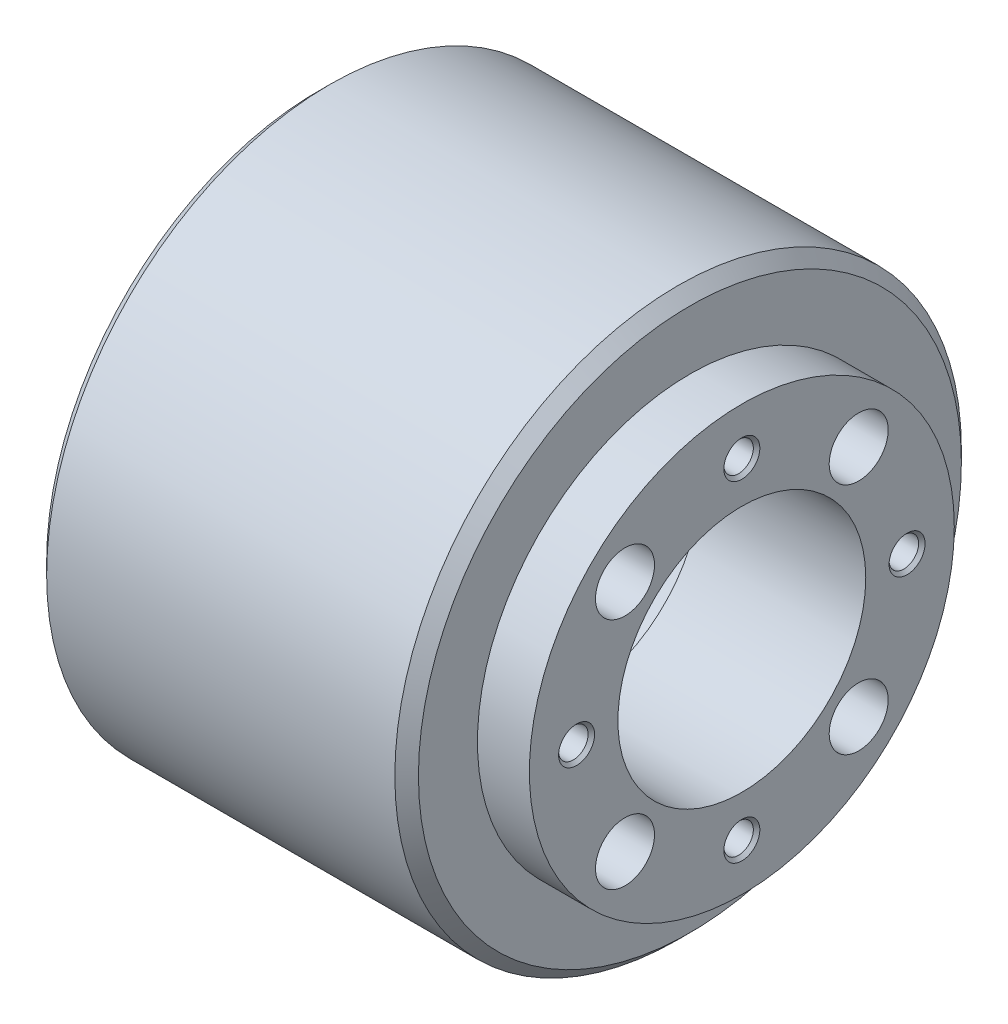
ISO-10303-21;
HEADER;
FILE_DESCRIPTION(('STEP AP214'),'2;1');
FILE_NAME('part.step','',(''),(''),'','','');
FILE_SCHEMA(('AUTOMOTIVE_DESIGN { 1 0 10303 214 1 1 1 1 }'));
ENDSEC;
DATA;
#1=APPLICATION_CONTEXT('core data for automotive mechanical design processes');
#2=APPLICATION_PROTOCOL_DEFINITION('international standard','automotive_design',2000,#1);
#3=PRODUCT_CONTEXT('',#1,'mechanical');
#4=PRODUCT('Part','Part','',(#3));
#5=PRODUCT_RELATED_PRODUCT_CATEGORY('part','',(#4));
#6=PRODUCT_DEFINITION_FORMATION('','',#4);
#7=PRODUCT_DEFINITION_CONTEXT('part definition',#1,'design');
#8=PRODUCT_DEFINITION('design','',#6,#7);
#9=PRODUCT_DEFINITION_SHAPE('','',#8);
#10=(LENGTH_UNIT() NAMED_UNIT(*) SI_UNIT(.MILLI.,.METRE.));
#11=(NAMED_UNIT(*) PLANE_ANGLE_UNIT() SI_UNIT($,.RADIAN.));
#12=(NAMED_UNIT(*) SI_UNIT($,.STERADIAN.) SOLID_ANGLE_UNIT());
#13=UNCERTAINTY_MEASURE_WITH_UNIT(LENGTH_MEASURE(1.E-05),#10,'distance_accuracy_value','');
#14=(GEOMETRIC_REPRESENTATION_CONTEXT(3) GLOBAL_UNCERTAINTY_ASSIGNED_CONTEXT((#13)) GLOBAL_UNIT_ASSIGNED_CONTEXT((#10,
#11,#12)) REPRESENTATION_CONTEXT('',''));
#15=CARTESIAN_POINT('',(0.,0.,0.));
#16=DIRECTION('',(0.,0.,1.));
#17=DIRECTION('',(1.,0.,0.));
#18=AXIS2_PLACEMENT_3D('',#15,#16,#17);
#19=CARTESIAN_POINT('',(0.,0.,19.5));
#20=DIRECTION('',(1.,0.,0.));
#21=DIRECTION('',(0.,0.,1.));
#22=AXIS2_PLACEMENT_3D('',#19,#20,#21);
#23=PLANE('',#22);
#24=CARTESIAN_POINT('',(0.,0.,0.));
#25=DIRECTION('',(-1.,0.,0.));
#26=DIRECTION('',(0.,0.,1.));
#27=AXIS2_PLACEMENT_3D('',#24,#25,#26);
#28=CIRCLE('',#27,20.5);
#29=CARTESIAN_POINT('',(0.,0.,20.5));
#30=VERTEX_POINT('',#29);
#31=EDGE_CURVE('E135',#30,#30,#28,.T.);
#32=ORIENTED_EDGE('',*,*,#31,.F.);
#33=EDGE_LOOP('',(#32));
#34=FACE_BOUND('',#33,.T.);
#35=CARTESIAN_POINT('',(0.,0.,0.));
#36=DIRECTION('',(-1.,0.,0.));
#37=DIRECTION('',(0.,0.,1.));
#38=AXIS2_PLACEMENT_3D('',#35,#36,#37);
#39=CIRCLE('',#38,23.);
#40=CARTESIAN_POINT('',(0.,0.,23.));
#41=VERTEX_POINT('',#40);
#42=EDGE_CURVE('E132',#41,#41,#39,.F.);
#43=ORIENTED_EDGE('',*,*,#42,.F.);
#44=EDGE_LOOP('',(#43));
#45=FACE_BOUND('',#44,.T.);
#46=ADVANCED_FACE('F37',(#34,#45),#23,.F.);
#47=CARTESIAN_POINT('',(0.,0.,0.));
#48=DIRECTION('',(-1.,0.,0.));
#49=DIRECTION('',(0.,0.,-1.));
#50=AXIS2_PLACEMENT_3D('',#47,#48,#49);
#51=CYLINDRICAL_SURFACE('',#50,24.);
#52=CARTESIAN_POINT('',(30.5,0.,0.));
#53=DIRECTION('',(1.,0.,0.));
#54=DIRECTION('',(0.,0.,-1.));
#55=AXIS2_PLACEMENT_3D('',#52,#53,#54);
#56=CIRCLE('',#55,24.);
#57=CARTESIAN_POINT('',(30.5,0.,-24.));
#58=VERTEX_POINT('',#57);
#59=EDGE_CURVE('E45',#58,#58,#56,.T.);
#60=ORIENTED_EDGE('',*,*,#59,.F.);
#61=EDGE_LOOP('',(#60));
#62=FACE_BOUND('',#61,.T.);
#63=CARTESIAN_POINT('',(0.99999999999999,0.,0.));
#64=DIRECTION('',(-1.,0.,0.));
#65=DIRECTION('',(0.,0.,1.));
#66=AXIS2_PLACEMENT_3D('',#63,#64,#65);
#67=CIRCLE('',#66,24.);
#68=CARTESIAN_POINT('',(0.99999999999999,0.,24.));
#69=VERTEX_POINT('',#68);
#70=EDGE_CURVE('E138',#69,#69,#67,.T.);
#71=ORIENTED_EDGE('',*,*,#70,.F.);
#72=EDGE_LOOP('',(#71));
#73=FACE_BOUND('',#72,.T.);
#74=ADVANCED_FACE('F145',(#62,#73),#51,.T.);
#75=CARTESIAN_POINT('',(31.5,0.,24.));
#76=DIRECTION('',(-1.,0.,0.));
#77=DIRECTION('',(0.,0.,-1.));
#78=AXIS2_PLACEMENT_3D('',#75,#76,#77);
#79=PLANE('',#78);
#80=CARTESIAN_POINT('',(31.5,0.,0.));
#81=DIRECTION('',(1.,0.,0.));
#82=DIRECTION('',(0.,0.,-1.));
#83=AXIS2_PLACEMENT_3D('',#80,#81,#82);
#84=CIRCLE('',#83,23.);
#85=CARTESIAN_POINT('',(31.5,0.,-23.));
#86=VERTEX_POINT('',#85);
#87=EDGE_CURVE('E11',#86,#86,#84,.F.);
#88=ORIENTED_EDGE('',*,*,#87,.F.);
#89=EDGE_LOOP('',(#88));
#90=FACE_BOUND('',#89,.T.);
#91=CARTESIAN_POINT('',(31.5,0.,0.));
#92=DIRECTION('',(1.,0.,0.));
#93=DIRECTION('',(0.,0.,-1.));
#94=AXIS2_PLACEMENT_3D('',#91,#92,#93);
#95=CIRCLE('',#94,18.);
#96=CARTESIAN_POINT('',(31.5,0.,-18.));
#97=VERTEX_POINT('',#96);
#98=EDGE_CURVE('E114',#97,#97,#95,.T.);
#99=ORIENTED_EDGE('',*,*,#98,.F.);
#100=EDGE_LOOP('',(#99));
#101=FACE_BOUND('',#100,.T.);
#102=ADVANCED_FACE('F148',(#90,#101),#79,.F.);
#103=CARTESIAN_POINT('',(0.,0.,0.));
#104=DIRECTION('',(-1.,0.,0.));
#105=DIRECTION('',(0.,0.,-1.));
#106=AXIS2_PLACEMENT_3D('',#103,#104,#105);
#107=CYLINDRICAL_SURFACE('',#106,18.);
#108=ORIENTED_EDGE('',*,*,#98,.T.);
#109=EDGE_LOOP('',(#108));
#110=FACE_BOUND('',#109,.T.);
#111=CARTESIAN_POINT('',(35.9,0.,0.));
#112=DIRECTION('',(1.,0.,0.));
#113=DIRECTION('',(0.,0.,-1.));
#114=AXIS2_PLACEMENT_3D('',#111,#112,#113);
#115=CIRCLE('',#114,18.);
#116=CARTESIAN_POINT('',(35.9,0.,-18.));
#117=VERTEX_POINT('',#116);
#118=EDGE_CURVE('E111',#117,#117,#115,.T.);
#119=ORIENTED_EDGE('',*,*,#118,.F.);
#120=EDGE_LOOP('',(#119));
#121=FACE_BOUND('',#120,.T.);
#122=ADVANCED_FACE('F185',(#110,#121),#107,.T.);
#123=CARTESIAN_POINT('',(35.9,0.,10.5));
#124=DIRECTION('',(-1.,0.,0.));
#125=DIRECTION('',(0.,0.,-1.));
#126=AXIS2_PLACEMENT_3D('',#123,#124,#125);
#127=PLANE('',#126);
#128=CARTESIAN_POINT('',(35.9,-9.89949493661167,9.89949493661166));
#129=DIRECTION('',(-1.,0.,0.));
#130=DIRECTION('',(0.,0.,-1.));
#131=AXIS2_PLACEMENT_3D('',#128,#129,#130);
#132=CIRCLE('',#131,2.5);
#133=CARTESIAN_POINT('',(35.9,-9.89949493661167,7.39949493661166));
#134=VERTEX_POINT('',#133);
#135=EDGE_CURVE('E302',#134,#134,#132,.T.);
#136=ORIENTED_EDGE('',*,*,#135,.T.);
#137=EDGE_LOOP('',(#136));
#138=FACE_BOUND('',#137,.T.);
#139=CARTESIAN_POINT('',(35.9,-9.89949493661167,-9.89949493661166));
#140=DIRECTION('',(-1.,0.,0.));
#141=DIRECTION('',(0.,0.,1.));
#142=AXIS2_PLACEMENT_3D('',#139,#140,#141);
#143=CIRCLE('',#142,2.5);
#144=CARTESIAN_POINT('',(35.9,-9.89949493661167,-7.39949493661166));
#145=VERTEX_POINT('',#144);
#146=EDGE_CURVE('E301',#145,#145,#143,.T.);
#147=ORIENTED_EDGE('',*,*,#146,.T.);
#148=EDGE_LOOP('',(#147));
#149=FACE_BOUND('',#148,.T.);
#150=CARTESIAN_POINT('',(35.9,9.89949493661167,9.89949493661167));
#151=DIRECTION('',(-1.,0.,0.));
#152=DIRECTION('',(0.,0.,-1.));
#153=AXIS2_PLACEMENT_3D('',#150,#151,#152);
#154=CIRCLE('',#153,2.5);
#155=CARTESIAN_POINT('',(35.9,9.89949493661167,7.39949493661166));
#156=VERTEX_POINT('',#155);
#157=EDGE_CURVE('E311',#156,#156,#154,.T.);
#158=ORIENTED_EDGE('',*,*,#157,.T.);
#159=EDGE_LOOP('',(#158));
#160=FACE_BOUND('',#159,.T.);
#161=CARTESIAN_POINT('',(35.9,9.89949493661167,-9.89949493661167));
#162=DIRECTION('',(-1.,0.,0.));
#163=DIRECTION('',(0.,0.,1.));
#164=AXIS2_PLACEMENT_3D('',#161,#162,#163);
#165=CIRCLE('',#164,2.5);
#166=CARTESIAN_POINT('',(35.9,9.89949493661167,-7.39949493661166));
#167=VERTEX_POINT('',#166);
#168=EDGE_CURVE('E316',#167,#167,#165,.T.);
#169=ORIENTED_EDGE('',*,*,#168,.T.);
#170=EDGE_LOOP('',(#169));
#171=FACE_BOUND('',#170,.T.);
#172=CARTESIAN_POINT('',(35.9,14.,0.));
#173=DIRECTION('',(-1.,0.,0.));
#174=DIRECTION('',(0.,0.,1.));
#175=AXIS2_PLACEMENT_3D('',#172,#173,#174);
#176=CIRCLE('',#175,1.525);
#177=CARTESIAN_POINT('',(35.9,14.,1.525));
#178=VERTEX_POINT('',#177);
#179=EDGE_CURVE('E75',#178,#178,#176,.T.);
#180=ORIENTED_EDGE('',*,*,#179,.T.);
#181=EDGE_LOOP('',(#180));
#182=FACE_BOUND('',#181,.T.);
#183=CARTESIAN_POINT('',(35.9,0.,14.));
#184=DIRECTION('',(-1.,0.,0.));
#185=DIRECTION('',(0.,0.,1.));
#186=AXIS2_PLACEMENT_3D('',#183,#184,#185);
#187=CIRCLE('',#186,1.525);
#188=CARTESIAN_POINT('',(35.9,0.,15.525));
#189=VERTEX_POINT('',#188);
#190=EDGE_CURVE('E68',#189,#189,#187,.T.);
#191=ORIENTED_EDGE('',*,*,#190,.T.);
#192=EDGE_LOOP('',(#191));
#193=FACE_BOUND('',#192,.T.);
#194=CARTESIAN_POINT('',(35.9,-14.,0.));
#195=DIRECTION('',(-1.,0.,0.));
#196=DIRECTION('',(0.,0.,1.));
#197=AXIS2_PLACEMENT_3D('',#194,#195,#196);
#198=CIRCLE('',#197,1.525);
#199=CARTESIAN_POINT('',(35.9,-14.,1.525));
#200=VERTEX_POINT('',#199);
#201=EDGE_CURVE('E84',#200,#200,#198,.T.);
#202=ORIENTED_EDGE('',*,*,#201,.T.);
#203=EDGE_LOOP('',(#202));
#204=FACE_BOUND('',#203,.T.);
#205=CARTESIAN_POINT('',(35.9,0.,-14.));
#206=DIRECTION('',(-1.,0.,0.));
#207=DIRECTION('',(0.,0.,1.));
#208=AXIS2_PLACEMENT_3D('',#205,#206,#207);
#209=CIRCLE('',#208,1.525);
#210=CARTESIAN_POINT('',(35.9,0.,-12.475));
#211=VERTEX_POINT('',#210);
#212=EDGE_CURVE('E93',#211,#211,#209,.T.);
#213=ORIENTED_EDGE('',*,*,#212,.T.);
#214=EDGE_LOOP('',(#213));
#215=FACE_BOUND('',#214,.T.);
#216=ORIENTED_EDGE('',*,*,#118,.T.);
#217=EDGE_LOOP('',(#216));
#218=FACE_BOUND('',#217,.T.);
#219=CARTESIAN_POINT('',(35.9,0.,0.));
#220=DIRECTION('',(1.,0.,0.));
#221=DIRECTION('',(0.,0.,-1.));
#222=AXIS2_PLACEMENT_3D('',#219,#220,#221);
#223=CIRCLE('',#222,10.5);
#224=CARTESIAN_POINT('',(35.9,0.,-10.5));
#225=VERTEX_POINT('',#224);
#226=EDGE_CURVE('E108',#225,#225,#223,.T.);
#227=ORIENTED_EDGE('',*,*,#226,.F.);
#228=EDGE_LOOP('',(#227));
#229=FACE_BOUND('',#228,.T.);
#230=ADVANCED_FACE('F190',(#138,#149,#160,#171,#182,#193,#204,#215,#218,#229),#127,.F.);
#231=CARTESIAN_POINT('',(0.,0.,0.));
#232=DIRECTION('',(-1.,0.,0.));
#233=DIRECTION('',(0.,0.,-1.));
#234=AXIS2_PLACEMENT_3D('',#231,#232,#233);
#235=CYLINDRICAL_SURFACE('',#234,10.5);
#236=ORIENTED_EDGE('',*,*,#226,.T.);
#237=EDGE_LOOP('',(#236));
#238=FACE_BOUND('',#237,.T.);
#239=CARTESIAN_POINT('',(21.9,0.,0.));
#240=DIRECTION('',(1.,0.,0.));
#241=DIRECTION('',(0.,0.,-1.));
#242=AXIS2_PLACEMENT_3D('',#239,#240,#241);
#243=CIRCLE('',#242,10.5);
#244=CARTESIAN_POINT('',(21.9,0.,-10.5));
#245=VERTEX_POINT('',#244);
#246=EDGE_CURVE('E105',#245,#245,#243,.T.);
#247=ORIENTED_EDGE('',*,*,#246,.F.);
#248=EDGE_LOOP('',(#247));
#249=FACE_BOUND('',#248,.T.);
#250=ADVANCED_FACE('F196',(#238,#249),#235,.F.);
#251=CARTESIAN_POINT('',(21.9,0.,15.));
#252=DIRECTION('',(1.,0.,0.));
#253=DIRECTION('',(0.,0.,1.));
#254=AXIS2_PLACEMENT_3D('',#251,#252,#253);
#255=PLANE('',#254);
#256=ORIENTED_EDGE('',*,*,#246,.T.);
#257=EDGE_LOOP('',(#256));
#258=FACE_BOUND('',#257,.T.);
#259=CARTESIAN_POINT('',(21.9,0.,0.));
#260=DIRECTION('',(1.,0.,0.));
#261=DIRECTION('',(0.,0.,-1.));
#262=AXIS2_PLACEMENT_3D('',#259,#260,#261);
#263=CIRCLE('',#262,15.);
#264=CARTESIAN_POINT('',(21.9,0.,-15.));
#265=VERTEX_POINT('',#264);
#266=EDGE_CURVE('E102',#265,#265,#263,.T.);
#267=ORIENTED_EDGE('',*,*,#266,.F.);
#268=EDGE_LOOP('',(#267));
#269=FACE_BOUND('',#268,.T.);
#270=ADVANCED_FACE('F203',(#258,#269),#255,.F.);
#271=CARTESIAN_POINT('',(0.,0.,0.));
#272=DIRECTION('',(-1.,0.,0.));
#273=DIRECTION('',(0.,0.,-1.));
#274=AXIS2_PLACEMENT_3D('',#271,#272,#273);
#275=CYLINDRICAL_SURFACE('',#274,15.);
#276=CARTESIAN_POINT('',(6.39999999999999,0.,0.));
#277=DIRECTION('',(-1.,0.,0.));
#278=DIRECTION('',(0.,0.,1.));
#279=AXIS2_PLACEMENT_3D('',#276,#277,#278);
#280=CIRCLE('',#279,15.);
#281=CARTESIAN_POINT('',(6.39999999999999,0.,15.));
#282=VERTEX_POINT('',#281);
#283=EDGE_CURVE('E129',#282,#282,#280,.F.);
#284=ORIENTED_EDGE('',*,*,#283,.F.);
#285=EDGE_LOOP('',(#284));
#286=FACE_BOUND('',#285,.T.);
#287=ORIENTED_EDGE('',*,*,#266,.T.);
#288=EDGE_LOOP('',(#287));
#289=FACE_BOUND('',#288,.T.);
#290=ADVANCED_FACE('F209',(#286,#289),#275,.F.);
#291=CARTESIAN_POINT('',(5.4,0.,15.));
#292=DIRECTION('',(1.,0.,0.));
#293=DIRECTION('',(0.,0.,1.));
#294=AXIS2_PLACEMENT_3D('',#291,#292,#293);
#295=PLANE('',#294);
#296=CARTESIAN_POINT('',(5.4,0.,0.));
#297=DIRECTION('',(-1.,0.,0.));
#298=DIRECTION('',(0.,0.,1.));
#299=AXIS2_PLACEMENT_3D('',#296,#297,#298);
#300=CIRCLE('',#299,18.5);
#301=CARTESIAN_POINT('',(5.4,0.,18.5));
#302=VERTEX_POINT('',#301);
#303=EDGE_CURVE('E120',#302,#302,#300,.F.);
#304=ORIENTED_EDGE('',*,*,#303,.F.);
#305=EDGE_LOOP('',(#304));
#306=FACE_BOUND('',#305,.T.);
#307=CARTESIAN_POINT('',(5.4,0.,0.));
#308=DIRECTION('',(-1.,0.,0.));
#309=DIRECTION('',(0.,0.,1.));
#310=AXIS2_PLACEMENT_3D('',#307,#308,#309);
#311=CIRCLE('',#310,16.);
#312=CARTESIAN_POINT('',(5.4,0.,16.));
#313=VERTEX_POINT('',#312);
#314=EDGE_CURVE('E117',#313,#313,#311,.T.);
#315=ORIENTED_EDGE('',*,*,#314,.F.);
#316=EDGE_LOOP('',(#315));
#317=FACE_BOUND('',#316,.T.);
#318=ADVANCED_FACE('F214',(#306,#317),#295,.F.);
#319=CARTESIAN_POINT('',(0.,0.,0.));
#320=DIRECTION('',(-1.,0.,0.));
#321=DIRECTION('',(0.,0.,-1.));
#322=AXIS2_PLACEMENT_3D('',#319,#320,#321);
#323=CYLINDRICAL_SURFACE('',#322,19.5);
#324=CARTESIAN_POINT('',(4.4,0.,0.));
#325=DIRECTION('',(-1.,0.,0.));
#326=DIRECTION('',(0.,0.,1.));
#327=AXIS2_PLACEMENT_3D('',#324,#325,#326);
#328=CIRCLE('',#327,19.5);
#329=CARTESIAN_POINT('',(4.4,0.,19.5));
#330=VERTEX_POINT('',#329);
#331=EDGE_CURVE('E126',#330,#330,#328,.T.);
#332=ORIENTED_EDGE('',*,*,#331,.F.);
#333=EDGE_LOOP('',(#332));
#334=FACE_BOUND('',#333,.T.);
#335=CARTESIAN_POINT('',(1.00000000000002,0.,0.));
#336=DIRECTION('',(-1.,0.,0.));
#337=DIRECTION('',(0.,0.,1.));
#338=AXIS2_PLACEMENT_3D('',#335,#336,#337);
#339=CIRCLE('',#338,19.5);
#340=CARTESIAN_POINT('',(1.00000000000002,0.,19.5));
#341=VERTEX_POINT('',#340);
#342=EDGE_CURVE('E123',#341,#341,#339,.F.);
#343=ORIENTED_EDGE('',*,*,#342,.F.);
#344=EDGE_LOOP('',(#343));
#345=FACE_BOUND('',#344,.T.);
#346=ADVANCED_FACE('F169',(#334,#345),#323,.F.);
#347=CARTESIAN_POINT('',(5.4,0.,0.));
#348=DIRECTION('',(-1.,0.,0.));
#349=DIRECTION('',(0.,0.,-1.));
#350=AXIS2_PLACEMENT_3D('',#347,#348,#349);
#351=CONICAL_SURFACE('',#350,18.5,0.785398163397454);
#352=ORIENTED_EDGE('',*,*,#331,.T.);
#353=EDGE_LOOP('',(#352));
#354=FACE_BOUND('',#353,.T.);
#355=ORIENTED_EDGE('',*,*,#303,.T.);
#356=EDGE_LOOP('',(#355));
#357=FACE_BOUND('',#356,.T.);
#358=ADVANCED_FACE('F165',(#354,#357),#351,.F.);
#359=CARTESIAN_POINT('',(6.39999999999999,0.,0.));
#360=DIRECTION('',(-1.,0.,0.));
#361=DIRECTION('',(0.,0.,-1.));
#362=AXIS2_PLACEMENT_3D('',#359,#360,#361);
#363=CONICAL_SURFACE('',#362,15.,0.785398163397453);
#364=ORIENTED_EDGE('',*,*,#314,.T.);
#365=EDGE_LOOP('',(#364));
#366=FACE_BOUND('',#365,.T.);
#367=ORIENTED_EDGE('',*,*,#283,.T.);
#368=EDGE_LOOP('',(#367));
#369=FACE_BOUND('',#368,.T.);
#370=ADVANCED_FACE('F168',(#366,#369),#363,.F.);
#371=CARTESIAN_POINT('',(1.00000000000002,0.,0.));
#372=DIRECTION('',(-1.,0.,0.));
#373=DIRECTION('',(0.,0.,-1.));
#374=AXIS2_PLACEMENT_3D('',#371,#372,#373);
#375=CONICAL_SURFACE('',#374,19.5,0.785398163397447);
#376=ORIENTED_EDGE('',*,*,#31,.T.);
#377=EDGE_LOOP('',(#376));
#378=FACE_BOUND('',#377,.T.);
#379=ORIENTED_EDGE('',*,*,#342,.T.);
#380=EDGE_LOOP('',(#379));
#381=FACE_BOUND('',#380,.T.);
#382=ADVANCED_FACE('F173',(#378,#381),#375,.F.);
#383=CARTESIAN_POINT('',(30.5,0.,0.));
#384=DIRECTION('',(-1.,0.,0.));
#385=DIRECTION('',(0.,0.,-1.));
#386=AXIS2_PLACEMENT_3D('',#383,#384,#385);
#387=CONICAL_SURFACE('',#386,24.,0.785398163397453);
#388=ORIENTED_EDGE('',*,*,#87,.T.);
#389=EDGE_LOOP('',(#388));
#390=FACE_BOUND('',#389,.T.);
#391=ORIENTED_EDGE('',*,*,#59,.T.);
#392=EDGE_LOOP('',(#391));
#393=FACE_BOUND('',#392,.T.);
#394=ADVANCED_FACE('F143',(#390,#393),#387,.T.);
#395=CARTESIAN_POINT('',(0.,0.,0.));
#396=DIRECTION('',(1.,0.,0.));
#397=DIRECTION('',(0.,0.,1.));
#398=AXIS2_PLACEMENT_3D('',#395,#396,#397);
#399=CONICAL_SURFACE('',#398,23.,0.785398163397445);
#400=ORIENTED_EDGE('',*,*,#70,.T.);
#401=EDGE_LOOP('',(#400));
#402=FACE_BOUND('',#401,.T.);
#403=ORIENTED_EDGE('',*,*,#42,.T.);
#404=EDGE_LOOP('',(#403));
#405=FACE_BOUND('',#404,.T.);
#406=ADVANCED_FACE('F39',(#402,#405),#399,.T.);
#407=CARTESIAN_POINT('',(27.4,0.,-14.));
#408=DIRECTION('',(1.,0.,0.));
#409=DIRECTION('',(0.,0.,1.));
#410=AXIS2_PLACEMENT_3D('',#407,#408,#409);
#411=CONICAL_SURFACE('',#410,1.25,1.02974425867665);
#412=CARTESIAN_POINT('',(26.6489242262156,0.,-14.));
#413=VERTEX_POINT('',#412);
#414=VERTEX_LOOP('',#413);
#415=FACE_BOUND('',#414,.T.);
#416=CARTESIAN_POINT('',(27.4,0.,-14.));
#417=DIRECTION('',(-1.,0.,0.));
#418=DIRECTION('',(0.,0.,1.));
#419=AXIS2_PLACEMENT_3D('',#416,#417,#418);
#420=CIRCLE('',#419,1.25);
#421=CARTESIAN_POINT('',(27.4,0.,-12.75));
#422=VERTEX_POINT('',#421);
#423=EDGE_CURVE('E99',#422,#422,#420,.T.);
#424=ORIENTED_EDGE('',*,*,#423,.F.);
#425=EDGE_LOOP('',(#424));
#426=FACE_BOUND('',#425,.T.);
#427=ADVANCED_FACE('F154',(#415,#426),#411,.F.);
#428=CARTESIAN_POINT('',(35.9,0.,-14.));
#429=DIRECTION('',(1.,0.,0.));
#430=DIRECTION('',(0.,0.,1.));
#431=AXIS2_PLACEMENT_3D('',#428,#429,#430);
#432=CYLINDRICAL_SURFACE('',#431,1.25);
#433=ORIENTED_EDGE('',*,*,#423,.T.);
#434=EDGE_LOOP('',(#433));
#435=FACE_BOUND('',#434,.T.);
#436=CARTESIAN_POINT('',(35.625,0.,-14.));
#437=DIRECTION('',(-1.,0.,0.));
#438=DIRECTION('',(0.,0.,1.));
#439=AXIS2_PLACEMENT_3D('',#436,#437,#438);
#440=CIRCLE('',#439,1.25);
#441=CARTESIAN_POINT('',(35.625,0.,-12.75));
#442=VERTEX_POINT('',#441);
#443=EDGE_CURVE('E96',#442,#442,#440,.T.);
#444=ORIENTED_EDGE('',*,*,#443,.F.);
#445=EDGE_LOOP('',(#444));
#446=FACE_BOUND('',#445,.T.);
#447=ADVANCED_FACE('F229',(#435,#446),#432,.F.);
#448=CARTESIAN_POINT('',(35.9,0.,-14.));
#449=DIRECTION('',(1.,0.,0.));
#450=DIRECTION('',(0.,0.,1.));
#451=AXIS2_PLACEMENT_3D('',#448,#449,#450);
#452=CONICAL_SURFACE('',#451,1.525,0.785398163397442);
#453=ORIENTED_EDGE('',*,*,#443,.T.);
#454=EDGE_LOOP('',(#453));
#455=FACE_BOUND('',#454,.T.);
#456=ORIENTED_EDGE('',*,*,#212,.F.);
#457=EDGE_LOOP('',(#456));
#458=FACE_BOUND('',#457,.T.);
#459=ADVANCED_FACE('F232',(#455,#458),#452,.F.);
#460=CARTESIAN_POINT('',(27.4,-14.,0.));
#461=DIRECTION('',(1.,0.,0.));
#462=DIRECTION('',(0.,0.,1.));
#463=AXIS2_PLACEMENT_3D('',#460,#461,#462);
#464=CONICAL_SURFACE('',#463,1.25,1.02974425867665);
#465=CARTESIAN_POINT('',(26.6489242262156,-14.,0.));
#466=VERTEX_POINT('',#465);
#467=VERTEX_LOOP('',#466);
#468=FACE_BOUND('',#467,.T.);
#469=CARTESIAN_POINT('',(27.4,-14.,0.));
#470=DIRECTION('',(-1.,0.,0.));
#471=DIRECTION('',(0.,0.,1.));
#472=AXIS2_PLACEMENT_3D('',#469,#470,#471);
#473=CIRCLE('',#472,1.25);
#474=CARTESIAN_POINT('',(27.4,-14.,1.25));
#475=VERTEX_POINT('',#474);
#476=EDGE_CURVE('E90',#475,#475,#473,.T.);
#477=ORIENTED_EDGE('',*,*,#476,.F.);
#478=EDGE_LOOP('',(#477));
#479=FACE_BOUND('',#478,.T.);
#480=ADVANCED_FACE('F236',(#468,#479),#464,.F.);
#481=CARTESIAN_POINT('',(35.9,-14.,0.));
#482=DIRECTION('',(1.,0.,0.));
#483=DIRECTION('',(0.,0.,1.));
#484=AXIS2_PLACEMENT_3D('',#481,#482,#483);
#485=CYLINDRICAL_SURFACE('',#484,1.25);
#486=ORIENTED_EDGE('',*,*,#476,.T.);
#487=EDGE_LOOP('',(#486));
#488=FACE_BOUND('',#487,.T.);
#489=CARTESIAN_POINT('',(35.625,-14.,0.));
#490=DIRECTION('',(-1.,0.,0.));
#491=DIRECTION('',(0.,0.,1.));
#492=AXIS2_PLACEMENT_3D('',#489,#490,#491);
#493=CIRCLE('',#492,1.25);
#494=CARTESIAN_POINT('',(35.625,-14.,1.25));
#495=VERTEX_POINT('',#494);
#496=EDGE_CURVE('E87',#495,#495,#493,.T.);
#497=ORIENTED_EDGE('',*,*,#496,.F.);
#498=EDGE_LOOP('',(#497));
#499=FACE_BOUND('',#498,.T.);
#500=ADVANCED_FACE('F240',(#488,#499),#485,.F.);
#501=CARTESIAN_POINT('',(35.9,-14.,0.));
#502=DIRECTION('',(1.,0.,0.));
#503=DIRECTION('',(0.,0.,1.));
#504=AXIS2_PLACEMENT_3D('',#501,#502,#503);
#505=CONICAL_SURFACE('',#504,1.525,0.785398163397442);
#506=ORIENTED_EDGE('',*,*,#496,.T.);
#507=EDGE_LOOP('',(#506));
#508=FACE_BOUND('',#507,.T.);
#509=ORIENTED_EDGE('',*,*,#201,.F.);
#510=EDGE_LOOP('',(#509));
#511=FACE_BOUND('',#510,.T.);
#512=ADVANCED_FACE('F243',(#508,#511),#505,.F.);
#513=CARTESIAN_POINT('',(27.4,0.,14.));
#514=DIRECTION('',(1.,0.,0.));
#515=DIRECTION('',(0.,0.,1.));
#516=AXIS2_PLACEMENT_3D('',#513,#514,#515);
#517=CONICAL_SURFACE('',#516,1.25,1.02974425867665);
#518=CARTESIAN_POINT('',(26.6489242262156,0.,14.));
#519=VERTEX_POINT('',#518);
#520=VERTEX_LOOP('',#519);
#521=FACE_BOUND('',#520,.T.);
#522=CARTESIAN_POINT('',(27.4,0.,14.));
#523=DIRECTION('',(-1.,0.,0.));
#524=DIRECTION('',(0.,0.,1.));
#525=AXIS2_PLACEMENT_3D('',#522,#523,#524);
#526=CIRCLE('',#525,1.25);
#527=CARTESIAN_POINT('',(27.4,0.,15.25));
#528=VERTEX_POINT('',#527);
#529=EDGE_CURVE('E81',#528,#528,#526,.T.);
#530=ORIENTED_EDGE('',*,*,#529,.F.);
#531=EDGE_LOOP('',(#530));
#532=FACE_BOUND('',#531,.T.);
#533=ADVANCED_FACE('F247',(#521,#532),#517,.F.);
#534=CARTESIAN_POINT('',(35.9,0.,14.));
#535=DIRECTION('',(1.,0.,0.));
#536=DIRECTION('',(0.,0.,1.));
#537=AXIS2_PLACEMENT_3D('',#534,#535,#536);
#538=CYLINDRICAL_SURFACE('',#537,1.25);
#539=ORIENTED_EDGE('',*,*,#529,.T.);
#540=EDGE_LOOP('',(#539));
#541=FACE_BOUND('',#540,.T.);
#542=CARTESIAN_POINT('',(35.625,0.,14.));
#543=DIRECTION('',(-1.,0.,0.));
#544=DIRECTION('',(0.,0.,1.));
#545=AXIS2_PLACEMENT_3D('',#542,#543,#544);
#546=CIRCLE('',#545,1.25);
#547=CARTESIAN_POINT('',(35.625,0.,15.25));
#548=VERTEX_POINT('',#547);
#549=EDGE_CURVE('E72',#548,#548,#546,.T.);
#550=ORIENTED_EDGE('',*,*,#549,.F.);
#551=EDGE_LOOP('',(#550));
#552=FACE_BOUND('',#551,.T.);
#553=ADVANCED_FACE('F251',(#541,#552),#538,.F.);
#554=CARTESIAN_POINT('',(35.9,0.,14.));
#555=DIRECTION('',(1.,0.,0.));
#556=DIRECTION('',(0.,0.,1.));
#557=AXIS2_PLACEMENT_3D('',#554,#555,#556);
#558=CONICAL_SURFACE('',#557,1.525,0.785398163397442);
#559=ORIENTED_EDGE('',*,*,#549,.T.);
#560=EDGE_LOOP('',(#559));
#561=FACE_BOUND('',#560,.T.);
#562=ORIENTED_EDGE('',*,*,#190,.F.);
#563=EDGE_LOOP('',(#562));
#564=FACE_BOUND('',#563,.T.);
#565=ADVANCED_FACE('F62',(#561,#564),#558,.F.);
#566=CARTESIAN_POINT('',(27.4,14.,0.));
#567=DIRECTION('',(1.,0.,0.));
#568=DIRECTION('',(0.,0.,1.));
#569=AXIS2_PLACEMENT_3D('',#566,#567,#568);
#570=CONICAL_SURFACE('',#569,1.25,1.02974425867665);
#571=CARTESIAN_POINT('',(26.6489242262156,14.,0.));
#572=VERTEX_POINT('',#571);
#573=VERTEX_LOOP('',#572);
#574=FACE_BOUND('',#573,.T.);
#575=CARTESIAN_POINT('',(27.4,14.,0.));
#576=DIRECTION('',(-1.,0.,0.));
#577=DIRECTION('',(0.,0.,1.));
#578=AXIS2_PLACEMENT_3D('',#575,#576,#577);
#579=CIRCLE('',#578,1.25);
#580=CARTESIAN_POINT('',(27.4,14.,1.25));
#581=VERTEX_POINT('',#580);
#582=EDGE_CURVE('E66',#581,#581,#579,.T.);
#583=ORIENTED_EDGE('',*,*,#582,.F.);
#584=EDGE_LOOP('',(#583));
#585=FACE_BOUND('',#584,.T.);
#586=ADVANCED_FACE('F58',(#574,#585),#570,.F.);
#587=CARTESIAN_POINT('',(35.9,14.,0.));
#588=DIRECTION('',(1.,0.,0.));
#589=DIRECTION('',(0.,0.,1.));
#590=AXIS2_PLACEMENT_3D('',#587,#588,#589);
#591=CYLINDRICAL_SURFACE('',#590,1.25);
#592=ORIENTED_EDGE('',*,*,#582,.T.);
#593=EDGE_LOOP('',(#592));
#594=FACE_BOUND('',#593,.T.);
#595=CARTESIAN_POINT('',(35.625,14.,0.));
#596=DIRECTION('',(-1.,0.,0.));
#597=DIRECTION('',(0.,0.,1.));
#598=AXIS2_PLACEMENT_3D('',#595,#596,#597);
#599=CIRCLE('',#598,1.25);
#600=CARTESIAN_POINT('',(35.625,14.,1.25));
#601=VERTEX_POINT('',#600);
#602=EDGE_CURVE('E69',#601,#601,#599,.T.);
#603=ORIENTED_EDGE('',*,*,#602,.F.);
#604=EDGE_LOOP('',(#603));
#605=FACE_BOUND('',#604,.T.);
#606=ADVANCED_FACE('F61',(#594,#605),#591,.F.);
#607=CARTESIAN_POINT('',(35.9,14.,0.));
#608=DIRECTION('',(1.,0.,0.));
#609=DIRECTION('',(0.,0.,1.));
#610=AXIS2_PLACEMENT_3D('',#607,#608,#609);
#611=CONICAL_SURFACE('',#610,1.525,0.785398163397442);
#612=ORIENTED_EDGE('',*,*,#602,.T.);
#613=EDGE_LOOP('',(#612));
#614=FACE_BOUND('',#613,.T.);
#615=ORIENTED_EDGE('',*,*,#179,.F.);
#616=EDGE_LOOP('',(#615));
#617=FACE_BOUND('',#616,.T.);
#618=ADVANCED_FACE('F261',(#614,#617),#611,.F.);
#619=CARTESIAN_POINT('',(25.9,9.89949493661167,-9.89949493661167));
#620=DIRECTION('',(1.,0.,0.));
#621=DIRECTION('',(0.,0.,1.));
#622=AXIS2_PLACEMENT_3D('',#619,#620,#621);
#623=CYLINDRICAL_SURFACE('',#622,2.5);
#624=CARTESIAN_POINT('',(25.9,9.89949493661167,-9.89949493661167));
#625=DIRECTION('',(-1.,0.,0.));
#626=DIRECTION('',(0.,0.,1.));
#627=AXIS2_PLACEMENT_3D('',#624,#625,#626);
#628=CIRCLE('',#627,2.5);
#629=CARTESIAN_POINT('',(25.9,9.89949493661167,-7.39949493661166));
#630=VERTEX_POINT('',#629);
#631=EDGE_CURVE('E319',#630,#630,#628,.T.);
#632=ORIENTED_EDGE('',*,*,#631,.T.);
#633=EDGE_LOOP('',(#632));
#634=FACE_BOUND('',#633,.T.);
#635=ORIENTED_EDGE('',*,*,#168,.F.);
#636=EDGE_LOOP('',(#635));
#637=FACE_BOUND('',#636,.T.);
#638=ADVANCED_FACE('F264',(#634,#637),#623,.F.);
#639=CARTESIAN_POINT('',(25.9,9.89949493661167,-9.89949493661167));
#640=DIRECTION('',(1.,0.,0.));
#641=DIRECTION('',(0.,0.,1.));
#642=AXIS2_PLACEMENT_3D('',#639,#640,#641);
#643=PLANE('',#642);
#644=ORIENTED_EDGE('',*,*,#631,.F.);
#645=EDGE_LOOP('',(#644));
#646=FACE_BOUND('',#645,.T.);
#647=ADVANCED_FACE('F268',(#646),#643,.T.);
#648=CARTESIAN_POINT('',(25.9,9.89949493661167,9.89949493661167));
#649=DIRECTION('',(1.,0.,0.));
#650=DIRECTION('',(0.,0.,1.));
#651=AXIS2_PLACEMENT_3D('',#648,#649,#650);
#652=CYLINDRICAL_SURFACE('',#651,2.5);
#653=CARTESIAN_POINT('',(25.9,9.89949493661167,9.89949493661167));
#654=DIRECTION('',(-1.,0.,0.));
#655=DIRECTION('',(0.,0.,-1.));
#656=AXIS2_PLACEMENT_3D('',#653,#654,#655);
#657=CIRCLE('',#656,2.5);
#658=CARTESIAN_POINT('',(25.9,9.89949493661167,7.39949493661166));
#659=VERTEX_POINT('',#658);
#660=EDGE_CURVE('E313',#659,#659,#657,.T.);
#661=ORIENTED_EDGE('',*,*,#660,.T.);
#662=EDGE_LOOP('',(#661));
#663=FACE_BOUND('',#662,.T.);
#664=ORIENTED_EDGE('',*,*,#157,.F.);
#665=EDGE_LOOP('',(#664));
#666=FACE_BOUND('',#665,.T.);
#667=ADVANCED_FACE('F272',(#663,#666),#652,.F.);
#668=CARTESIAN_POINT('',(25.9,9.89949493661167,9.89949493661167));
#669=DIRECTION('',(-1.,0.,0.));
#670=DIRECTION('',(0.,0.,-1.));
#671=AXIS2_PLACEMENT_3D('',#668,#669,#670);
#672=PLANE('',#671);
#673=ORIENTED_EDGE('',*,*,#660,.F.);
#674=EDGE_LOOP('',(#673));
#675=FACE_BOUND('',#674,.T.);
#676=ADVANCED_FACE('F276',(#675),#672,.F.);
#677=CARTESIAN_POINT('',(25.9,-9.89949493661167,-9.89949493661166));
#678=DIRECTION('',(1.,0.,0.));
#679=DIRECTION('',(0.,0.,1.));
#680=AXIS2_PLACEMENT_3D('',#677,#678,#679);
#681=CYLINDRICAL_SURFACE('',#680,2.5);
#682=CARTESIAN_POINT('',(25.9,-9.89949493661167,-9.89949493661166));
#683=DIRECTION('',(-1.,0.,0.));
#684=DIRECTION('',(0.,0.,1.));
#685=AXIS2_PLACEMENT_3D('',#682,#683,#684);
#686=CIRCLE('',#685,2.5);
#687=CARTESIAN_POINT('',(25.9,-9.89949493661167,-7.39949493661166));
#688=VERTEX_POINT('',#687);
#689=EDGE_CURVE('E305',#688,#688,#686,.T.);
#690=ORIENTED_EDGE('',*,*,#689,.T.);
#691=EDGE_LOOP('',(#690));
#692=FACE_BOUND('',#691,.T.);
#693=ORIENTED_EDGE('',*,*,#146,.F.);
#694=EDGE_LOOP('',(#693));
#695=FACE_BOUND('',#694,.T.);
#696=ADVANCED_FACE('F280',(#692,#695),#681,.F.);
#697=CARTESIAN_POINT('',(25.9,-9.89949493661167,-9.89949493661166));
#698=DIRECTION('',(1.,0.,0.));
#699=DIRECTION('',(0.,0.,1.));
#700=AXIS2_PLACEMENT_3D('',#697,#698,#699);
#701=PLANE('',#700);
#702=ORIENTED_EDGE('',*,*,#689,.F.);
#703=EDGE_LOOP('',(#702));
#704=FACE_BOUND('',#703,.T.);
#705=ADVANCED_FACE('F284',(#704),#701,.T.);
#706=CARTESIAN_POINT('',(25.9,-9.89949493661167,9.89949493661166));
#707=DIRECTION('',(1.,0.,0.));
#708=DIRECTION('',(0.,0.,1.));
#709=AXIS2_PLACEMENT_3D('',#706,#707,#708);
#710=CYLINDRICAL_SURFACE('',#709,2.5);
#711=CARTESIAN_POINT('',(25.9,-9.89949493661167,9.89949493661166));
#712=DIRECTION('',(-1.,0.,0.));
#713=DIRECTION('',(0.,0.,-1.));
#714=AXIS2_PLACEMENT_3D('',#711,#712,#713);
#715=CIRCLE('',#714,2.5);
#716=CARTESIAN_POINT('',(25.9,-9.89949493661167,7.39949493661166));
#717=VERTEX_POINT('',#716);
#718=EDGE_CURVE('E300',#717,#717,#715,.T.);
#719=ORIENTED_EDGE('',*,*,#718,.T.);
#720=EDGE_LOOP('',(#719));
#721=FACE_BOUND('',#720,.T.);
#722=ORIENTED_EDGE('',*,*,#135,.F.);
#723=EDGE_LOOP('',(#722));
#724=FACE_BOUND('',#723,.T.);
#725=ADVANCED_FACE('F288',(#721,#724),#710,.F.);
#726=CARTESIAN_POINT('',(25.9,-9.89949493661167,9.89949493661166));
#727=DIRECTION('',(-1.,0.,0.));
#728=DIRECTION('',(0.,0.,-1.));
#729=AXIS2_PLACEMENT_3D('',#726,#727,#728);
#730=PLANE('',#729);
#731=ORIENTED_EDGE('',*,*,#718,.F.);
#732=EDGE_LOOP('',(#731));
#733=FACE_BOUND('',#732,.T.);
#734=ADVANCED_FACE('F292',(#733),#730,.F.);
#735=CLOSED_SHELL('',(#46,#74,#102,#122,#230,#250,#270,#290,#318,#346,#358,#370,#382,#394,#406,
#427,#447,#459,#480,#500,#512,#533,#553,#565,#586,#606,#618,#638,#647,#667,#676,#696,#705,#725,#734));
#736=MANIFOLD_SOLID_BREP('B2',#735);
#737=ADVANCED_BREP_SHAPE_REPRESENTATION('',(#18,#736),#14);
#738=SHAPE_DEFINITION_REPRESENTATION(#9,#737);
ENDSEC;
END-ISO-10303-21;
